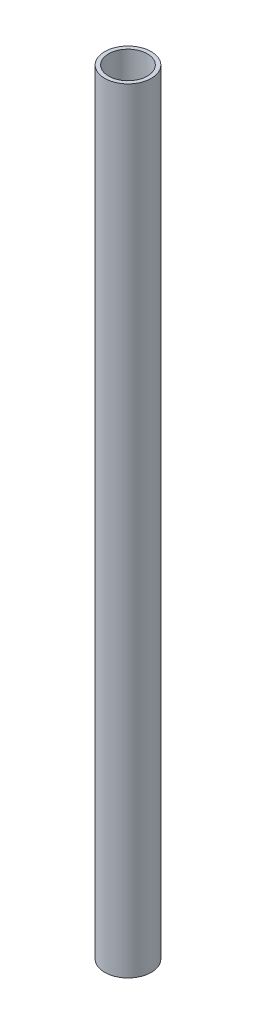
ISO-10303-21;
HEADER;
FILE_DESCRIPTION(('STEP AP214'),'2;1');
FILE_NAME('part.step','',(''),(''),'','','');
FILE_SCHEMA(('AUTOMOTIVE_DESIGN { 1 0 10303 214 1 1 1 1 }'));
ENDSEC;
DATA;
#1=APPLICATION_CONTEXT('core data for automotive mechanical design processes');
#2=APPLICATION_PROTOCOL_DEFINITION('international standard','automotive_design',2000,#1);
#3=PRODUCT_CONTEXT('',#1,'mechanical');
#4=PRODUCT('Part','Part','',(#3));
#5=PRODUCT_RELATED_PRODUCT_CATEGORY('part','',(#4));
#6=PRODUCT_DEFINITION_FORMATION('','',#4);
#7=PRODUCT_DEFINITION_CONTEXT('part definition',#1,'design');
#8=PRODUCT_DEFINITION('design','',#6,#7);
#9=PRODUCT_DEFINITION_SHAPE('','',#8);
#10=(LENGTH_UNIT() NAMED_UNIT(*) SI_UNIT(.MILLI.,.METRE.));
#11=(NAMED_UNIT(*) PLANE_ANGLE_UNIT() SI_UNIT($,.RADIAN.));
#12=(NAMED_UNIT(*) SI_UNIT($,.STERADIAN.) SOLID_ANGLE_UNIT());
#13=UNCERTAINTY_MEASURE_WITH_UNIT(LENGTH_MEASURE(1.E-05),#10,'distance_accuracy_value','');
#14=(GEOMETRIC_REPRESENTATION_CONTEXT(3) GLOBAL_UNCERTAINTY_ASSIGNED_CONTEXT((#13)) GLOBAL_UNIT_ASSIGNED_CONTEXT((#10,
#11,#12)) REPRESENTATION_CONTEXT('',''));
#15=CARTESIAN_POINT('',(0.,0.,0.));
#16=DIRECTION('',(0.,0.,1.));
#17=DIRECTION('',(1.,0.,0.));
#18=AXIS2_PLACEMENT_3D('',#15,#16,#17);
#19=CARTESIAN_POINT('',(0.,200.,0.));
#20=DIRECTION('',(0.,1.,0.));
#21=DIRECTION('',(0.,0.,1.));
#22=AXIS2_PLACEMENT_3D('',#19,#20,#21);
#23=PLANE('',#22);
#24=CARTESIAN_POINT('',(0.,200.,0.));
#25=DIRECTION('',(0.,1.,0.));
#26=DIRECTION('',(0.,0.,1.));
#27=AXIS2_PLACEMENT_3D('',#24,#25,#26);
#28=CIRCLE('',#27,6.);
#29=CARTESIAN_POINT('',(0.,200.,6.));
#30=VERTEX_POINT('',#29);
#31=EDGE_CURVE('E10',#30,#30,#28,.T.);
#32=ORIENTED_EDGE('',*,*,#31,.T.);
#33=EDGE_LOOP('',(#32));
#34=FACE_BOUND('',#33,.T.);
#35=CARTESIAN_POINT('',(0.,200.,0.));
#36=DIRECTION('',(0.,1.,0.));
#37=DIRECTION('',(0.,0.,1.));
#38=AXIS2_PLACEMENT_3D('',#35,#36,#37);
#39=CIRCLE('',#38,5.);
#40=CARTESIAN_POINT('',(0.,200.,5.));
#41=VERTEX_POINT('',#40);
#42=EDGE_CURVE('E44',#41,#41,#39,.T.);
#43=ORIENTED_EDGE('',*,*,#42,.F.);
#44=EDGE_LOOP('',(#43));
#45=FACE_BOUND('',#44,.T.);
#46=ADVANCED_FACE('F33',(#34,#45),#23,.T.);
#47=CARTESIAN_POINT('',(0.,0.,0.));
#48=DIRECTION('',(0.,1.,0.));
#49=DIRECTION('',(0.,0.,1.));
#50=AXIS2_PLACEMENT_3D('',#47,#48,#49);
#51=PLANE('',#50);
#52=CARTESIAN_POINT('',(0.,0.,0.));
#53=DIRECTION('',(0.,1.,0.));
#54=DIRECTION('',(0.,0.,1.));
#55=AXIS2_PLACEMENT_3D('',#52,#53,#54);
#56=CIRCLE('',#55,6.);
#57=CARTESIAN_POINT('',(0.,0.,6.));
#58=VERTEX_POINT('',#57);
#59=EDGE_CURVE('E37',#58,#58,#56,.T.);
#60=ORIENTED_EDGE('',*,*,#59,.F.);
#61=EDGE_LOOP('',(#60));
#62=FACE_BOUND('',#61,.T.);
#63=CARTESIAN_POINT('',(0.,0.,0.));
#64=DIRECTION('',(0.,1.,0.));
#65=DIRECTION('',(0.,0.,1.));
#66=AXIS2_PLACEMENT_3D('',#63,#64,#65);
#67=CIRCLE('',#66,5.);
#68=CARTESIAN_POINT('',(0.,0.,5.));
#69=VERTEX_POINT('',#68);
#70=EDGE_CURVE('E46',#69,#69,#67,.T.);
#71=ORIENTED_EDGE('',*,*,#70,.T.);
#72=EDGE_LOOP('',(#71));
#73=FACE_BOUND('',#72,.T.);
#74=ADVANCED_FACE('F56',(#62,#73),#51,.F.);
#75=CARTESIAN_POINT('',(0.,200.,0.));
#76=DIRECTION('',(0.,-1.,0.));
#77=DIRECTION('',(0.,0.,-1.));
#78=AXIS2_PLACEMENT_3D('',#75,#76,#77);
#79=CYLINDRICAL_SURFACE('',#78,6.);
#80=ORIENTED_EDGE('',*,*,#31,.F.);
#81=EDGE_LOOP('',(#80));
#82=FACE_BOUND('',#81,.T.);
#83=ORIENTED_EDGE('',*,*,#59,.T.);
#84=EDGE_LOOP('',(#83));
#85=FACE_BOUND('',#84,.T.);
#86=ADVANCED_FACE('F35',(#82,#85),#79,.T.);
#87=CARTESIAN_POINT('',(0.,200.,0.));
#88=DIRECTION('',(0.,-1.,0.));
#89=DIRECTION('',(0.,0.,-1.));
#90=AXIS2_PLACEMENT_3D('',#87,#88,#89);
#91=CYLINDRICAL_SURFACE('',#90,5.);
#92=ORIENTED_EDGE('',*,*,#42,.T.);
#93=EDGE_LOOP('',(#92));
#94=FACE_BOUND('',#93,.T.);
#95=ORIENTED_EDGE('',*,*,#70,.F.);
#96=EDGE_LOOP('',(#95));
#97=FACE_BOUND('',#96,.T.);
#98=ADVANCED_FACE('F52',(#94,#97),#91,.F.);
#99=CLOSED_SHELL('',(#46,#74,#86,#98));
#100=MANIFOLD_SOLID_BREP('B2',#99);
#101=ADVANCED_BREP_SHAPE_REPRESENTATION('',(#18,#100),#14);
#102=SHAPE_DEFINITION_REPRESENTATION(#9,#101);
ENDSEC;
END-ISO-10303-21;
